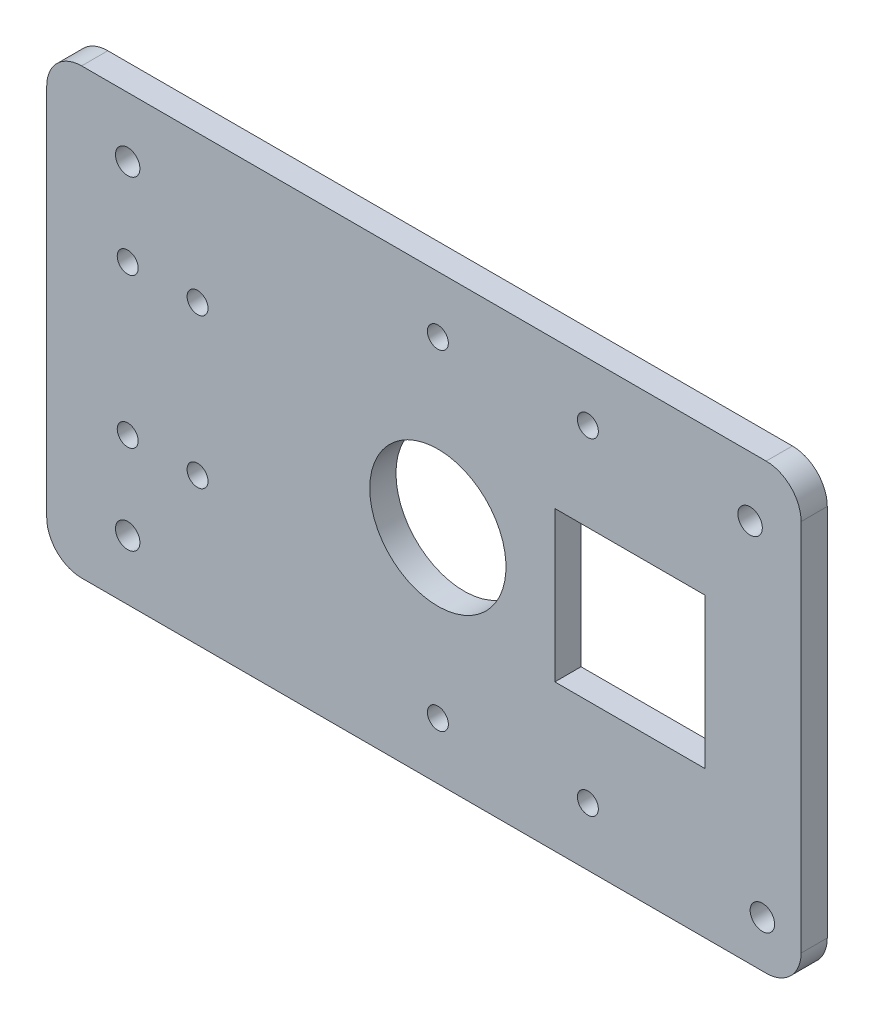
ISO-10303-21;
HEADER;
FILE_DESCRIPTION(('STEP AP214'),'2;1');
FILE_NAME('part.step','',(''),(''),'','','');
FILE_SCHEMA(('AUTOMOTIVE_DESIGN { 1 0 10303 214 1 1 1 1 }'));
ENDSEC;
DATA;
#1=APPLICATION_CONTEXT('core data for automotive mechanical design processes');
#2=APPLICATION_PROTOCOL_DEFINITION('international standard','automotive_design',2000,#1);
#3=PRODUCT_CONTEXT('',#1,'mechanical');
#4=PRODUCT('Part','Part','',(#3));
#5=PRODUCT_RELATED_PRODUCT_CATEGORY('part','',(#4));
#6=PRODUCT_DEFINITION_FORMATION('','',#4);
#7=PRODUCT_DEFINITION_CONTEXT('part definition',#1,'design');
#8=PRODUCT_DEFINITION('design','',#6,#7);
#9=PRODUCT_DEFINITION_SHAPE('','',#8);
#10=(LENGTH_UNIT() NAMED_UNIT(*) SI_UNIT(.MILLI.,.METRE.));
#11=(NAMED_UNIT(*) PLANE_ANGLE_UNIT() SI_UNIT($,.RADIAN.));
#12=(NAMED_UNIT(*) SI_UNIT($,.STERADIAN.) SOLID_ANGLE_UNIT());
#13=UNCERTAINTY_MEASURE_WITH_UNIT(LENGTH_MEASURE(1.E-05),#10,'distance_accuracy_value','');
#14=(GEOMETRIC_REPRESENTATION_CONTEXT(3) GLOBAL_UNCERTAINTY_ASSIGNED_CONTEXT((#13)) GLOBAL_UNIT_ASSIGNED_CONTEXT((#10,
#11,#12)) REPRESENTATION_CONTEXT('',''));
#15=CARTESIAN_POINT('',(0.,0.,0.));
#16=DIRECTION('',(0.,0.,1.));
#17=DIRECTION('',(1.,0.,0.));
#18=AXIS2_PLACEMENT_3D('',#15,#16,#17);
#19=CARTESIAN_POINT('',(0.,0.,17.5));
#20=DIRECTION('',(0.,0.,-1.));
#21=DIRECTION('',(-1.,0.,0.));
#22=AXIS2_PLACEMENT_3D('',#19,#20,#21);
#23=PLANE('',#22);
#24=CARTESIAN_POINT('',(-84.8116679666902,-46.37,17.5));
#25=DIRECTION('',(0.,0.,-1.));
#26=DIRECTION('',(-1.,0.,0.));
#27=AXIS2_PLACEMENT_3D('',#24,#25,#26);
#28=CIRCLE('',#27,3.50000000000001);
#29=CARTESIAN_POINT('',(-88.3116679666902,-46.37,17.5));
#30=VERTEX_POINT('',#29);
#31=EDGE_CURVE('E153',#30,#30,#28,.F.);
#32=ORIENTED_EDGE('',*,*,#31,.T.);
#33=EDGE_LOOP('',(#32));
#34=FACE_BOUND('',#33,.T.);
#35=CARTESIAN_POINT('',(93.3990574545653,46.37,17.5));
#36=DIRECTION('',(0.,0.,-1.));
#37=DIRECTION('',(-1.,0.,0.));
#38=AXIS2_PLACEMENT_3D('',#35,#36,#37);
#39=CIRCLE('',#38,3.50000000000001);
#40=CARTESIAN_POINT('',(89.8990574545653,46.37,17.5));
#41=VERTEX_POINT('',#40);
#42=EDGE_CURVE('E211',#41,#41,#39,.F.);
#43=ORIENTED_EDGE('',*,*,#42,.T.);
#44=EDGE_LOOP('',(#43));
#45=FACE_BOUND('',#44,.T.);
#46=CARTESIAN_POINT('',(46.9495287272827,46.81,17.5));
#47=DIRECTION('',(0.,0.,-1.));
#48=DIRECTION('',(-1.,0.,0.));
#49=AXIS2_PLACEMENT_3D('',#46,#47,#48);
#50=CIRCLE('',#49,2.99999999999999);
#51=CARTESIAN_POINT('',(43.9495287272827,46.81,17.5));
#52=VERTEX_POINT('',#51);
#53=EDGE_CURVE('E205',#52,#52,#50,.F.);
#54=ORIENTED_EDGE('',*,*,#53,.T.);
#55=EDGE_LOOP('',(#54));
#56=FACE_BOUND('',#55,.T.);
#57=CARTESIAN_POINT('',(-64.8116679666902,-21.4350000000001,17.5));
#58=DIRECTION('',(0.,0.,-1.));
#59=DIRECTION('',(-1.,0.,0.));
#60=AXIS2_PLACEMENT_3D('',#57,#58,#59);
#61=CIRCLE('',#60,2.99999999999999);
#62=CARTESIAN_POINT('',(-67.8116679666901,-21.4350000000001,17.5));
#63=VERTEX_POINT('',#62);
#64=EDGE_CURVE('E177',#63,#63,#61,.T.);
#65=ORIENTED_EDGE('',*,*,#64,.F.);
#66=EDGE_LOOP('',(#65));
#67=FACE_BOUND('',#66,.T.);
#68=CARTESIAN_POINT('',(-64.8116679666902,21.4349999999999,17.5));
#69=DIRECTION('',(0.,0.,-1.));
#70=DIRECTION('',(-1.,0.,0.));
#71=AXIS2_PLACEMENT_3D('',#68,#69,#70);
#72=CIRCLE('',#71,2.99999999999999);
#73=CARTESIAN_POINT('',(-67.8116679666901,21.4349999999999,17.5));
#74=VERTEX_POINT('',#73);
#75=EDGE_CURVE('E199',#74,#74,#72,.F.);
#76=ORIENTED_EDGE('',*,*,#75,.T.);
#77=EDGE_LOOP('',(#76));
#78=FACE_BOUND('',#77,.T.);
#79=CARTESIAN_POINT('',(4.00000000000006,-47.25,17.5));
#80=DIRECTION('',(0.,0.,-1.));
#81=DIRECTION('',(-1.,0.,0.));
#82=AXIS2_PLACEMENT_3D('',#79,#80,#81);
#83=CIRCLE('',#82,3.);
#84=CARTESIAN_POINT('',(1.00000000000006,-47.25,17.5));
#85=VERTEX_POINT('',#84);
#86=EDGE_CURVE('E179',#85,#85,#83,.T.);
#87=ORIENTED_EDGE('',*,*,#86,.F.);
#88=EDGE_LOOP('',(#87));
#89=FACE_BOUND('',#88,.T.);
#90=CARTESIAN_POINT('',(-84.8116679666902,-21.435,17.5));
#91=DIRECTION('',(0.,0.,-1.));
#92=DIRECTION('',(-1.,0.,0.));
#93=AXIS2_PLACEMENT_3D('',#90,#91,#92);
#94=CIRCLE('',#93,2.99999999999999);
#95=CARTESIAN_POINT('',(-87.8116679666901,-21.435,17.5));
#96=VERTEX_POINT('',#95);
#97=EDGE_CURVE('E37',#96,#96,#94,.T.);
#98=ORIENTED_EDGE('',*,*,#97,.F.);
#99=EDGE_LOOP('',(#98));
#100=FACE_BOUND('',#99,.T.);
#101=CARTESIAN_POINT('',(-84.8116679666902,21.435,17.5));
#102=DIRECTION('',(0.,0.,-1.));
#103=DIRECTION('',(-1.,0.,0.));
#104=AXIS2_PLACEMENT_3D('',#101,#102,#103);
#105=CIRCLE('',#104,2.99999999999999);
#106=CARTESIAN_POINT('',(-87.8116679666901,21.435,17.5));
#107=VERTEX_POINT('',#106);
#108=EDGE_CURVE('E202',#107,#107,#105,.F.);
#109=ORIENTED_EDGE('',*,*,#108,.T.);
#110=EDGE_LOOP('',(#109));
#111=FACE_BOUND('',#110,.T.);
#112=CARTESIAN_POINT('',(46.9495287272827,-46.81,17.5));
#113=DIRECTION('',(0.,0.,-1.));
#114=DIRECTION('',(-1.,0.,0.));
#115=AXIS2_PLACEMENT_3D('',#112,#113,#114);
#116=CIRCLE('',#115,2.99999999999999);
#117=CARTESIAN_POINT('',(43.9495287272827,-46.81,17.5));
#118=VERTEX_POINT('',#117);
#119=EDGE_CURVE('E174',#118,#118,#116,.T.);
#120=ORIENTED_EDGE('',*,*,#119,.F.);
#121=EDGE_LOOP('',(#120));
#122=FACE_BOUND('',#121,.T.);
#123=CARTESIAN_POINT('',(4.00000000000006,47.25,17.5));
#124=DIRECTION('',(0.,0.,-1.));
#125=DIRECTION('',(-1.,0.,0.));
#126=AXIS2_PLACEMENT_3D('',#123,#124,#125);
#127=CIRCLE('',#126,3.);
#128=CARTESIAN_POINT('',(1.00000000000006,47.25,17.5));
#129=VERTEX_POINT('',#128);
#130=EDGE_CURVE('E208',#129,#129,#127,.F.);
#131=ORIENTED_EDGE('',*,*,#130,.T.);
#132=EDGE_LOOP('',(#131));
#133=FACE_BOUND('',#132,.T.);
#134=CARTESIAN_POINT('',(96.9145553930181,-50.1725670547442,17.5));
#135=DIRECTION('',(0.,0.,-1.));
#136=DIRECTION('',(-1.,0.,0.));
#137=AXIS2_PLACEMENT_3D('',#134,#135,#136);
#138=CIRCLE('',#137,3.50000000000001);
#139=CARTESIAN_POINT('',(93.4145553930181,-50.1725670547442,17.5));
#140=VERTEX_POINT('',#139);
#141=EDGE_CURVE('E214',#140,#140,#138,.F.);
#142=ORIENTED_EDGE('',*,*,#141,.T.);
#143=EDGE_LOOP('',(#142));
#144=FACE_BOUND('',#143,.T.);
#145=CARTESIAN_POINT('',(-84.8116679666902,46.37,17.5));
#146=DIRECTION('',(0.,0.,-1.));
#147=DIRECTION('',(-1.,0.,0.));
#148=AXIS2_PLACEMENT_3D('',#145,#146,#147);
#149=CIRCLE('',#148,3.50000000000001);
#150=CARTESIAN_POINT('',(-88.3116679666902,46.37,17.5));
#151=VERTEX_POINT('',#150);
#152=EDGE_CURVE('E147',#151,#151,#149,.F.);
#153=ORIENTED_EDGE('',*,*,#152,.T.);
#154=EDGE_LOOP('',(#153));
#155=FACE_BOUND('',#154,.T.);
#156=DIRECTION('',(-1.,0.,0.));
#157=VECTOR('',#156,1.);
#158=CARTESIAN_POINT('',(37.5000000000001,21.5,17.5));
#159=LINE('',#158,#157);
#160=CARTESIAN_POINT('',(80.5000000000001,21.5,17.5));
#161=VERTEX_POINT('',#160);
#162=CARTESIAN_POINT('',(37.5000000000001,21.5,17.5));
#163=VERTEX_POINT('',#162);
#164=EDGE_CURVE('E127',#161,#163,#159,.T.);
#165=ORIENTED_EDGE('',*,*,#164,.T.);
#166=DIRECTION('',(0.,-1.,0.));
#167=VECTOR('',#166,1.);
#168=CARTESIAN_POINT('',(37.5000000000001,-21.5,17.5));
#169=LINE('',#168,#167);
#170=CARTESIAN_POINT('',(37.5000000000001,-21.5,17.5));
#171=VERTEX_POINT('',#170);
#172=EDGE_CURVE('E138',#163,#171,#169,.T.);
#173=ORIENTED_EDGE('',*,*,#172,.T.);
#174=DIRECTION('',(-1.,0.,0.));
#175=VECTOR('',#174,1.);
#176=CARTESIAN_POINT('',(37.5000000000001,-21.5,17.5));
#177=LINE('',#176,#175);
#178=CARTESIAN_POINT('',(80.5000000000001,-21.5,17.5));
#179=VERTEX_POINT('',#178);
#180=EDGE_CURVE('E140',#179,#171,#177,.T.);
#181=ORIENTED_EDGE('',*,*,#180,.F.);
#182=DIRECTION('',(0.,-1.,0.));
#183=VECTOR('',#182,1.);
#184=CARTESIAN_POINT('',(80.5000000000001,-21.5,17.5));
#185=LINE('',#184,#183);
#186=EDGE_CURVE('E139',#161,#179,#185,.T.);
#187=ORIENTED_EDGE('',*,*,#186,.F.);
#188=EDGE_LOOP('',(#165,#173,#181,#187));
#189=FACE_BOUND('',#188,.T.);
#190=CARTESIAN_POINT('',(-98.,53.5,17.5));
#191=DIRECTION('',(0.,0.,-1.));
#192=DIRECTION('',(-1.,0.,0.));
#193=AXIS2_PLACEMENT_3D('',#190,#191,#192);
#194=CIRCLE('',#193,10.);
#195=CARTESIAN_POINT('',(-98.,63.5,17.5));
#196=VERTEX_POINT('',#195);
#197=CARTESIAN_POINT('',(-108.,53.5,17.5));
#198=VERTEX_POINT('',#197);
#199=EDGE_CURVE('E165',#196,#198,#194,.F.);
#200=ORIENTED_EDGE('',*,*,#199,.F.);
#201=DIRECTION('',(1.,0.,0.));
#202=VECTOR('',#201,1.);
#203=CARTESIAN_POINT('',(-108.,63.5,17.5));
#204=LINE('',#203,#202);
#205=CARTESIAN_POINT('',(98.,63.5,17.5));
#206=VERTEX_POINT('',#205);
#207=EDGE_CURVE('E159',#196,#206,#204,.T.);
#208=ORIENTED_EDGE('',*,*,#207,.T.);
#209=CARTESIAN_POINT('',(98.,53.5,17.5));
#210=DIRECTION('',(0.,0.,-1.));
#211=DIRECTION('',(-1.,0.,0.));
#212=AXIS2_PLACEMENT_3D('',#209,#210,#211);
#213=CIRCLE('',#212,10.);
#214=CARTESIAN_POINT('',(108.,53.5,17.5));
#215=VERTEX_POINT('',#214);
#216=EDGE_CURVE('E169',#215,#206,#213,.F.);
#217=ORIENTED_EDGE('',*,*,#216,.F.);
#218=DIRECTION('',(0.,-1.,0.));
#219=VECTOR('',#218,1.);
#220=CARTESIAN_POINT('',(108.,63.5,17.5));
#221=LINE('',#220,#219);
#222=CARTESIAN_POINT('',(108.,-53.5,17.5));
#223=VERTEX_POINT('',#222);
#224=EDGE_CURVE('E141',#215,#223,#221,.T.);
#225=ORIENTED_EDGE('',*,*,#224,.T.);
#226=CARTESIAN_POINT('',(98.0000000000001,-53.5,17.5));
#227=DIRECTION('',(0.,0.,-1.));
#228=DIRECTION('',(-1.,0.,0.));
#229=AXIS2_PLACEMENT_3D('',#226,#227,#228);
#230=CIRCLE('',#229,10.);
#231=CARTESIAN_POINT('',(98.,-63.5,17.5));
#232=VERTEX_POINT('',#231);
#233=EDGE_CURVE('E171',#232,#223,#230,.F.);
#234=ORIENTED_EDGE('',*,*,#233,.F.);
#235=DIRECTION('',(-1.,0.,0.));
#236=VECTOR('',#235,1.);
#237=CARTESIAN_POINT('',(-108.,-63.5,17.5));
#238=LINE('',#237,#236);
#239=CARTESIAN_POINT('',(-98.,-63.5,17.5));
#240=VERTEX_POINT('',#239);
#241=EDGE_CURVE('E146',#232,#240,#238,.T.);
#242=ORIENTED_EDGE('',*,*,#241,.T.);
#243=CARTESIAN_POINT('',(-98.,-53.5,17.5));
#244=DIRECTION('',(0.,0.,-1.));
#245=DIRECTION('',(-1.,0.,0.));
#246=AXIS2_PLACEMENT_3D('',#243,#244,#245);
#247=CIRCLE('',#246,10.);
#248=CARTESIAN_POINT('',(-108.,-53.5,17.5));
#249=VERTEX_POINT('',#248);
#250=EDGE_CURVE('E167',#249,#240,#247,.F.);
#251=ORIENTED_EDGE('',*,*,#250,.F.);
#252=DIRECTION('',(0.,1.,0.));
#253=VECTOR('',#252,1.);
#254=CARTESIAN_POINT('',(-108.,63.5,17.5));
#255=LINE('',#254,#253);
#256=EDGE_CURVE('E150',#249,#198,#255,.T.);
#257=ORIENTED_EDGE('',*,*,#256,.T.);
#258=EDGE_LOOP('',(#200,#208,#217,#225,#234,#242,#251,#257));
#259=FACE_BOUND('',#258,.T.);
#260=CARTESIAN_POINT('',(4.00000000000006,0.,17.5));
#261=DIRECTION('',(0.,0.,-1.));
#262=DIRECTION('',(-1.,0.,0.));
#263=AXIS2_PLACEMENT_3D('',#260,#261,#262);
#264=CIRCLE('',#263,19.5);
#265=CARTESIAN_POINT('',(-15.4999999999999,0.,17.5));
#266=VERTEX_POINT('',#265);
#267=EDGE_CURVE('E308',#266,#266,#264,.T.);
#268=ORIENTED_EDGE('',*,*,#267,.F.);
#269=EDGE_LOOP('',(#268));
#270=FACE_BOUND('',#269,.T.);
#271=ADVANCED_FACE('F33',(#34,#45,#56,#67,#78,#89,#100,#111,#122,#133,#144,#155,#189,#259,#270),
#23,.T.);
#272=CARTESIAN_POINT('',(-108.,63.5,25.));
#273=DIRECTION('',(0.,-1.,0.));
#274=DIRECTION('',(0.,0.,-1.));
#275=AXIS2_PLACEMENT_3D('',#272,#273,#274);
#276=PLANE('',#275);
#277=ORIENTED_EDGE('',*,*,#207,.F.);
#278=DIRECTION('',(0.,0.,-1.));
#279=VECTOR('',#278,1.);
#280=CARTESIAN_POINT('',(-98.,63.5,25.));
#281=LINE('',#280,#279);
#282=CARTESIAN_POINT('',(-98.,63.5,25.));
#283=VERTEX_POINT('',#282);
#284=EDGE_CURVE('E294',#196,#283,#281,.F.);
#285=ORIENTED_EDGE('',*,*,#284,.T.);
#286=DIRECTION('',(-1.,0.,0.));
#287=VECTOR('',#286,1.);
#288=CARTESIAN_POINT('',(-108.,63.5,25.));
#289=LINE('',#288,#287);
#290=CARTESIAN_POINT('',(98.,63.5,25.));
#291=VERTEX_POINT('',#290);
#292=EDGE_CURVE('E303',#291,#283,#289,.T.);
#293=ORIENTED_EDGE('',*,*,#292,.F.);
#294=DIRECTION('',(0.,0.,-1.));
#295=VECTOR('',#294,1.);
#296=CARTESIAN_POINT('',(98.,63.5,25.));
#297=LINE('',#296,#295);
#298=EDGE_CURVE('E195',#291,#206,#297,.T.);
#299=ORIENTED_EDGE('',*,*,#298,.T.);
#300=EDGE_LOOP('',(#277,#285,#293,#299));
#301=FACE_BOUND('',#300,.T.);
#302=ADVANCED_FACE('F238',(#301),#276,.F.);
#303=CARTESIAN_POINT('',(0.,0.,25.));
#304=DIRECTION('',(0.,0.,1.));
#305=DIRECTION('',(1.,0.,0.));
#306=AXIS2_PLACEMENT_3D('',#303,#304,#305);
#307=PLANE('',#306);
#308=CARTESIAN_POINT('',(4.00000000000006,-47.25,25.));
#309=DIRECTION('',(0.,0.,1.));
#310=DIRECTION('',(1.,0.,0.));
#311=AXIS2_PLACEMENT_3D('',#308,#309,#310);
#312=CIRCLE('',#311,3.);
#313=CARTESIAN_POINT('',(7.00000000000006,-47.25,25.));
#314=VERTEX_POINT('',#313);
#315=EDGE_CURVE('E342',#314,#314,#312,.T.);
#316=ORIENTED_EDGE('',*,*,#315,.F.);
#317=EDGE_LOOP('',(#316));
#318=FACE_BOUND('',#317,.T.);
#319=CARTESIAN_POINT('',(-64.8116679666902,21.4349999999999,25.));
#320=DIRECTION('',(0.,0.,-1.));
#321=DIRECTION('',(-1.,0.,0.));
#322=AXIS2_PLACEMENT_3D('',#319,#320,#321);
#323=CIRCLE('',#322,2.99999999999999);
#324=CARTESIAN_POINT('',(-67.8116679666901,21.4349999999999,25.));
#325=VERTEX_POINT('',#324);
#326=EDGE_CURVE('E339',#325,#325,#323,.T.);
#327=ORIENTED_EDGE('',*,*,#326,.T.);
#328=EDGE_LOOP('',(#327));
#329=FACE_BOUND('',#328,.T.);
#330=CARTESIAN_POINT('',(-84.8116679666902,21.435,25.));
#331=DIRECTION('',(0.,0.,-1.));
#332=DIRECTION('',(-1.,0.,0.));
#333=AXIS2_PLACEMENT_3D('',#330,#331,#332);
#334=CIRCLE('',#333,2.99999999999999);
#335=CARTESIAN_POINT('',(-87.8116679666901,21.435,25.));
#336=VERTEX_POINT('',#335);
#337=EDGE_CURVE('E335',#336,#336,#334,.T.);
#338=ORIENTED_EDGE('',*,*,#337,.T.);
#339=EDGE_LOOP('',(#338));
#340=FACE_BOUND('',#339,.T.);
#341=CARTESIAN_POINT('',(46.9495287272827,-46.81,25.));
#342=DIRECTION('',(0.,0.,1.));
#343=DIRECTION('',(1.,0.,0.));
#344=AXIS2_PLACEMENT_3D('',#341,#342,#343);
#345=CIRCLE('',#344,2.99999999999999);
#346=CARTESIAN_POINT('',(49.9495287272827,-46.81,25.));
#347=VERTEX_POINT('',#346);
#348=EDGE_CURVE('E11',#347,#347,#345,.T.);
#349=ORIENTED_EDGE('',*,*,#348,.F.);
#350=EDGE_LOOP('',(#349));
#351=FACE_BOUND('',#350,.T.);
#352=CARTESIAN_POINT('',(4.00000000000006,47.25,25.));
#353=DIRECTION('',(0.,0.,-1.));
#354=DIRECTION('',(-1.,0.,0.));
#355=AXIS2_PLACEMENT_3D('',#352,#353,#354);
#356=CIRCLE('',#355,3.);
#357=CARTESIAN_POINT('',(1.00000000000006,47.25,25.));
#358=VERTEX_POINT('',#357);
#359=EDGE_CURVE('E327',#358,#358,#356,.T.);
#360=ORIENTED_EDGE('',*,*,#359,.T.);
#361=EDGE_LOOP('',(#360));
#362=FACE_BOUND('',#361,.T.);
#363=CARTESIAN_POINT('',(93.3990574545653,46.37,25.));
#364=DIRECTION('',(0.,0.,1.));
#365=DIRECTION('',(1.,0.,0.));
#366=AXIS2_PLACEMENT_3D('',#363,#364,#365);
#367=CIRCLE('',#366,3.50000000000001);
#368=CARTESIAN_POINT('',(96.8990574545653,46.37,25.));
#369=VERTEX_POINT('',#368);
#370=EDGE_CURVE('E324',#369,#369,#367,.T.);
#371=ORIENTED_EDGE('',*,*,#370,.F.);
#372=EDGE_LOOP('',(#371));
#373=FACE_BOUND('',#372,.T.);
#374=CARTESIAN_POINT('',(96.9145553930181,-50.1725670547442,25.));
#375=DIRECTION('',(0.,0.,1.));
#376=DIRECTION('',(1.,0.,0.));
#377=AXIS2_PLACEMENT_3D('',#374,#375,#376);
#378=CIRCLE('',#377,3.50000000000001);
#379=CARTESIAN_POINT('',(100.414555393018,-50.1725670547442,25.));
#380=VERTEX_POINT('',#379);
#381=EDGE_CURVE('E328',#380,#380,#378,.T.);
#382=ORIENTED_EDGE('',*,*,#381,.F.);
#383=EDGE_LOOP('',(#382));
#384=FACE_BOUND('',#383,.T.);
#385=CARTESIAN_POINT('',(-84.8116679666902,-46.37,25.));
#386=DIRECTION('',(0.,0.,1.));
#387=DIRECTION('',(1.,0.,0.));
#388=AXIS2_PLACEMENT_3D('',#385,#386,#387);
#389=CIRCLE('',#388,3.50000000000001);
#390=CARTESIAN_POINT('',(-81.3116679666902,-46.37,25.));
#391=VERTEX_POINT('',#390);
#392=EDGE_CURVE('E323',#391,#391,#389,.T.);
#393=ORIENTED_EDGE('',*,*,#392,.F.);
#394=EDGE_LOOP('',(#393));
#395=FACE_BOUND('',#394,.T.);
#396=CARTESIAN_POINT('',(-84.8116679666902,46.37,25.));
#397=DIRECTION('',(0.,0.,1.));
#398=DIRECTION('',(1.,0.,0.));
#399=AXIS2_PLACEMENT_3D('',#396,#397,#398);
#400=CIRCLE('',#399,3.50000000000001);
#401=CARTESIAN_POINT('',(-81.3116679666902,46.37,25.));
#402=VERTEX_POINT('',#401);
#403=EDGE_CURVE('E320',#402,#402,#400,.T.);
#404=ORIENTED_EDGE('',*,*,#403,.F.);
#405=EDGE_LOOP('',(#404));
#406=FACE_BOUND('',#405,.T.);
#407=DIRECTION('',(0.,1.,0.));
#408=VECTOR('',#407,1.);
#409=CARTESIAN_POINT('',(37.5000000000001,-21.5,25.));
#410=LINE('',#409,#408);
#411=CARTESIAN_POINT('',(37.5000000000001,-21.5,25.));
#412=VERTEX_POINT('',#411);
#413=CARTESIAN_POINT('',(37.5000000000001,21.5,25.));
#414=VERTEX_POINT('',#413);
#415=EDGE_CURVE('E318',#412,#414,#410,.T.);
#416=ORIENTED_EDGE('',*,*,#415,.T.);
#417=DIRECTION('',(1.,0.,0.));
#418=VECTOR('',#417,1.);
#419=CARTESIAN_POINT('',(37.5000000000001,21.5,25.));
#420=LINE('',#419,#418);
#421=CARTESIAN_POINT('',(80.5000000000001,21.5,25.));
#422=VERTEX_POINT('',#421);
#423=EDGE_CURVE('E130',#414,#422,#420,.T.);
#424=ORIENTED_EDGE('',*,*,#423,.T.);
#425=DIRECTION('',(0.,1.,0.));
#426=VECTOR('',#425,1.);
#427=CARTESIAN_POINT('',(80.5000000000001,-21.5,25.));
#428=LINE('',#427,#426);
#429=CARTESIAN_POINT('',(80.5000000000001,-21.5,25.));
#430=VERTEX_POINT('',#429);
#431=EDGE_CURVE('E314',#430,#422,#428,.T.);
#432=ORIENTED_EDGE('',*,*,#431,.F.);
#433=DIRECTION('',(1.,0.,0.));
#434=VECTOR('',#433,1.);
#435=CARTESIAN_POINT('',(37.5000000000001,-21.5,25.));
#436=LINE('',#435,#434);
#437=EDGE_CURVE('E58',#412,#430,#436,.T.);
#438=ORIENTED_EDGE('',*,*,#437,.F.);
#439=EDGE_LOOP('',(#416,#424,#432,#438));
#440=FACE_BOUND('',#439,.T.);
#441=CARTESIAN_POINT('',(4.00000000000006,0.,25.));
#442=DIRECTION('',(0.,0.,-1.));
#443=DIRECTION('',(-1.,0.,0.));
#444=AXIS2_PLACEMENT_3D('',#441,#442,#443);
#445=CIRCLE('',#444,19.5);
#446=CARTESIAN_POINT('',(-15.4999999999999,0.,25.));
#447=VERTEX_POINT('',#446);
#448=EDGE_CURVE('E307',#447,#447,#445,.T.);
#449=ORIENTED_EDGE('',*,*,#448,.T.);
#450=EDGE_LOOP('',(#449));
#451=FACE_BOUND('',#450,.T.);
#452=DIRECTION('',(0.,-1.,0.));
#453=VECTOR('',#452,1.);
#454=CARTESIAN_POINT('',(-108.,63.5,25.));
#455=LINE('',#454,#453);
#456=CARTESIAN_POINT('',(-108.,53.5,25.));
#457=VERTEX_POINT('',#456);
#458=CARTESIAN_POINT('',(-108.,-53.5,25.));
#459=VERTEX_POINT('',#458);
#460=EDGE_CURVE('E299',#457,#459,#455,.T.);
#461=ORIENTED_EDGE('',*,*,#460,.T.);
#462=CARTESIAN_POINT('',(-98.,-53.5,25.));
#463=DIRECTION('',(0.,0.,1.));
#464=DIRECTION('',(1.,0.,0.));
#465=AXIS2_PLACEMENT_3D('',#462,#463,#464);
#466=CIRCLE('',#465,10.);
#467=CARTESIAN_POINT('',(-98.,-63.5,25.));
#468=VERTEX_POINT('',#467);
#469=EDGE_CURVE('E286',#459,#468,#466,.T.);
#470=ORIENTED_EDGE('',*,*,#469,.T.);
#471=DIRECTION('',(1.,0.,0.));
#472=VECTOR('',#471,1.);
#473=CARTESIAN_POINT('',(-108.,-63.5,25.));
#474=LINE('',#473,#472);
#475=CARTESIAN_POINT('',(98.,-63.5,25.));
#476=VERTEX_POINT('',#475);
#477=EDGE_CURVE('E296',#468,#476,#474,.T.);
#478=ORIENTED_EDGE('',*,*,#477,.T.);
#479=CARTESIAN_POINT('',(98.0000000000001,-53.5,25.));
#480=DIRECTION('',(0.,0.,1.));
#481=DIRECTION('',(1.,0.,0.));
#482=AXIS2_PLACEMENT_3D('',#479,#480,#481);
#483=CIRCLE('',#482,10.);
#484=CARTESIAN_POINT('',(108.,-53.5,25.));
#485=VERTEX_POINT('',#484);
#486=EDGE_CURVE('E285',#476,#485,#483,.T.);
#487=ORIENTED_EDGE('',*,*,#486,.T.);
#488=DIRECTION('',(0.,1.,0.));
#489=VECTOR('',#488,1.);
#490=CARTESIAN_POINT('',(108.,63.5,25.));
#491=LINE('',#490,#489);
#492=CARTESIAN_POINT('',(108.,53.5,25.));
#493=VERTEX_POINT('',#492);
#494=EDGE_CURVE('E305',#485,#493,#491,.T.);
#495=ORIENTED_EDGE('',*,*,#494,.T.);
#496=CARTESIAN_POINT('',(98.,53.5,25.));
#497=DIRECTION('',(0.,0.,1.));
#498=DIRECTION('',(1.,0.,0.));
#499=AXIS2_PLACEMENT_3D('',#496,#497,#498);
#500=CIRCLE('',#499,10.);
#501=EDGE_CURVE('E280',#493,#291,#500,.T.);
#502=ORIENTED_EDGE('',*,*,#501,.T.);
#503=ORIENTED_EDGE('',*,*,#292,.T.);
#504=CARTESIAN_POINT('',(-98.,53.5,25.));
#505=DIRECTION('',(0.,0.,1.));
#506=DIRECTION('',(1.,0.,0.));
#507=AXIS2_PLACEMENT_3D('',#504,#505,#506);
#508=CIRCLE('',#507,10.);
#509=EDGE_CURVE('E292',#283,#457,#508,.T.);
#510=ORIENTED_EDGE('',*,*,#509,.T.);
#511=EDGE_LOOP('',(#461,#470,#478,#487,#495,#502,#503,#510));
#512=FACE_BOUND('',#511,.T.);
#513=CARTESIAN_POINT('',(46.9495287272827,46.81,25.));
#514=DIRECTION('',(0.,0.,-1.));
#515=DIRECTION('',(-1.,0.,0.));
#516=AXIS2_PLACEMENT_3D('',#513,#514,#515);
#517=CIRCLE('',#516,2.99999999999999);
#518=CARTESIAN_POINT('',(43.9495287272827,46.81,25.));
#519=VERTEX_POINT('',#518);
#520=EDGE_CURVE('E42',#519,#519,#517,.T.);
#521=ORIENTED_EDGE('',*,*,#520,.T.);
#522=EDGE_LOOP('',(#521));
#523=FACE_BOUND('',#522,.T.);
#524=CARTESIAN_POINT('',(-64.8116679666902,-21.4350000000001,25.));
#525=DIRECTION('',(0.,0.,1.));
#526=DIRECTION('',(1.,0.,0.));
#527=AXIS2_PLACEMENT_3D('',#524,#525,#526);
#528=CIRCLE('',#527,2.99999999999999);
#529=CARTESIAN_POINT('',(-61.8116679666902,-21.4350000000001,25.));
#530=VERTEX_POINT('',#529);
#531=EDGE_CURVE('E338',#530,#530,#528,.T.);
#532=ORIENTED_EDGE('',*,*,#531,.F.);
#533=EDGE_LOOP('',(#532));
#534=FACE_BOUND('',#533,.T.);
#535=CARTESIAN_POINT('',(-84.8116679666902,-21.435,25.));
#536=DIRECTION('',(0.,0.,1.));
#537=DIRECTION('',(1.,0.,0.));
#538=AXIS2_PLACEMENT_3D('',#535,#536,#537);
#539=CIRCLE('',#538,2.99999999999999);
#540=CARTESIAN_POINT('',(-81.8116679666902,-21.435,25.));
#541=VERTEX_POINT('',#540);
#542=EDGE_CURVE('E334',#541,#541,#539,.T.);
#543=ORIENTED_EDGE('',*,*,#542,.F.);
#544=EDGE_LOOP('',(#543));
#545=FACE_BOUND('',#544,.T.);
#546=ADVANCED_FACE('F240',(#318,#329,#340,#351,#362,#373,#384,#395,#406,#440,#451,#512,#523,
#534,#545),#307,.T.);
#547=CARTESIAN_POINT('',(-84.8116679666902,-21.435,25.));
#548=DIRECTION('',(0.,0.,-1.));
#549=DIRECTION('',(-1.,0.,0.));
#550=AXIS2_PLACEMENT_3D('',#547,#548,#549);
#551=CYLINDRICAL_SURFACE('',#550,2.99999999999999);
#552=ORIENTED_EDGE('',*,*,#542,.T.);
#553=EDGE_LOOP('',(#552));
#554=FACE_BOUND('',#553,.T.);
#555=ORIENTED_EDGE('',*,*,#97,.T.);
#556=EDGE_LOOP('',(#555));
#557=FACE_BOUND('',#556,.T.);
#558=ADVANCED_FACE('F247',(#554,#557),#551,.F.);
#559=CARTESIAN_POINT('',(4.00000000000006,-47.25,25.));
#560=DIRECTION('',(0.,0.,-1.));
#561=DIRECTION('',(-1.,0.,0.));
#562=AXIS2_PLACEMENT_3D('',#559,#560,#561);
#563=CYLINDRICAL_SURFACE('',#562,3.);
#564=ORIENTED_EDGE('',*,*,#315,.T.);
#565=EDGE_LOOP('',(#564));
#566=FACE_BOUND('',#565,.T.);
#567=ORIENTED_EDGE('',*,*,#86,.T.);
#568=EDGE_LOOP('',(#567));
#569=FACE_BOUND('',#568,.T.);
#570=ADVANCED_FACE('F392',(#566,#569),#563,.F.);
#571=CARTESIAN_POINT('',(-64.8116679666902,21.4349999999999,25.));
#572=DIRECTION('',(0.,0.,-1.));
#573=DIRECTION('',(-1.,0.,0.));
#574=AXIS2_PLACEMENT_3D('',#571,#572,#573);
#575=CYLINDRICAL_SURFACE('',#574,2.99999999999999);
#576=ORIENTED_EDGE('',*,*,#326,.F.);
#577=EDGE_LOOP('',(#576));
#578=FACE_BOUND('',#577,.T.);
#579=ORIENTED_EDGE('',*,*,#75,.F.);
#580=EDGE_LOOP('',(#579));
#581=FACE_BOUND('',#580,.T.);
#582=ADVANCED_FACE('F396',(#578,#581),#575,.F.);
#583=CARTESIAN_POINT('',(-84.8116679666902,21.435,25.));
#584=DIRECTION('',(0.,0.,-1.));
#585=DIRECTION('',(-1.,0.,0.));
#586=AXIS2_PLACEMENT_3D('',#583,#584,#585);
#587=CYLINDRICAL_SURFACE('',#586,2.99999999999999);
#588=ORIENTED_EDGE('',*,*,#337,.F.);
#589=EDGE_LOOP('',(#588));
#590=FACE_BOUND('',#589,.T.);
#591=ORIENTED_EDGE('',*,*,#108,.F.);
#592=EDGE_LOOP('',(#591));
#593=FACE_BOUND('',#592,.T.);
#594=ADVANCED_FACE('F400',(#590,#593),#587,.F.);
#595=CARTESIAN_POINT('',(-64.8116679666902,-21.4350000000001,25.));
#596=DIRECTION('',(0.,0.,-1.));
#597=DIRECTION('',(-1.,0.,0.));
#598=AXIS2_PLACEMENT_3D('',#595,#596,#597);
#599=CYLINDRICAL_SURFACE('',#598,2.99999999999999);
#600=ORIENTED_EDGE('',*,*,#531,.T.);
#601=EDGE_LOOP('',(#600));
#602=FACE_BOUND('',#601,.T.);
#603=ORIENTED_EDGE('',*,*,#64,.T.);
#604=EDGE_LOOP('',(#603));
#605=FACE_BOUND('',#604,.T.);
#606=ADVANCED_FACE('F404',(#602,#605),#599,.F.);
#607=CARTESIAN_POINT('',(46.9495287272827,46.81,25.));
#608=DIRECTION('',(0.,0.,-1.));
#609=DIRECTION('',(-1.,0.,0.));
#610=AXIS2_PLACEMENT_3D('',#607,#608,#609);
#611=CYLINDRICAL_SURFACE('',#610,2.99999999999999);
#612=ORIENTED_EDGE('',*,*,#520,.F.);
#613=EDGE_LOOP('',(#612));
#614=FACE_BOUND('',#613,.T.);
#615=ORIENTED_EDGE('',*,*,#53,.F.);
#616=EDGE_LOOP('',(#615));
#617=FACE_BOUND('',#616,.T.);
#618=ADVANCED_FACE('F408',(#614,#617),#611,.F.);
#619=CARTESIAN_POINT('',(46.9495287272827,-46.81,25.));
#620=DIRECTION('',(0.,0.,-1.));
#621=DIRECTION('',(-1.,0.,0.));
#622=AXIS2_PLACEMENT_3D('',#619,#620,#621);
#623=CYLINDRICAL_SURFACE('',#622,2.99999999999999);
#624=ORIENTED_EDGE('',*,*,#348,.T.);
#625=EDGE_LOOP('',(#624));
#626=FACE_BOUND('',#625,.T.);
#627=ORIENTED_EDGE('',*,*,#119,.T.);
#628=EDGE_LOOP('',(#627));
#629=FACE_BOUND('',#628,.T.);
#630=ADVANCED_FACE('F412',(#626,#629),#623,.F.);
#631=CARTESIAN_POINT('',(4.00000000000006,47.25,25.));
#632=DIRECTION('',(0.,0.,-1.));
#633=DIRECTION('',(-1.,0.,0.));
#634=AXIS2_PLACEMENT_3D('',#631,#632,#633);
#635=CYLINDRICAL_SURFACE('',#634,3.);
#636=ORIENTED_EDGE('',*,*,#359,.F.);
#637=EDGE_LOOP('',(#636));
#638=FACE_BOUND('',#637,.T.);
#639=ORIENTED_EDGE('',*,*,#130,.F.);
#640=EDGE_LOOP('',(#639));
#641=FACE_BOUND('',#640,.T.);
#642=ADVANCED_FACE('F416',(#638,#641),#635,.F.);
#643=CARTESIAN_POINT('',(93.3990574545653,46.37,-53.75));
#644=DIRECTION('',(0.,0.,1.));
#645=DIRECTION('',(1.,0.,0.));
#646=AXIS2_PLACEMENT_3D('',#643,#644,#645);
#647=CYLINDRICAL_SURFACE('',#646,3.50000000000001);
#648=ORIENTED_EDGE('',*,*,#370,.T.);
#649=EDGE_LOOP('',(#648));
#650=FACE_BOUND('',#649,.T.);
#651=ORIENTED_EDGE('',*,*,#42,.F.);
#652=EDGE_LOOP('',(#651));
#653=FACE_BOUND('',#652,.T.);
#654=ADVANCED_FACE('F234',(#650,#653),#647,.F.);
#655=CARTESIAN_POINT('',(96.9145553930181,-50.1725670547442,-53.75));
#656=DIRECTION('',(0.,0.,1.));
#657=DIRECTION('',(1.,0.,0.));
#658=AXIS2_PLACEMENT_3D('',#655,#656,#657);
#659=CYLINDRICAL_SURFACE('',#658,3.50000000000001);
#660=ORIENTED_EDGE('',*,*,#381,.T.);
#661=EDGE_LOOP('',(#660));
#662=FACE_BOUND('',#661,.T.);
#663=ORIENTED_EDGE('',*,*,#141,.F.);
#664=EDGE_LOOP('',(#663));
#665=FACE_BOUND('',#664,.T.);
#666=ADVANCED_FACE('F224',(#662,#665),#659,.F.);
#667=CARTESIAN_POINT('',(-84.8116679666902,-46.37,-53.75));
#668=DIRECTION('',(0.,0.,1.));
#669=DIRECTION('',(1.,0.,0.));
#670=AXIS2_PLACEMENT_3D('',#667,#668,#669);
#671=CYLINDRICAL_SURFACE('',#670,3.50000000000001);
#672=ORIENTED_EDGE('',*,*,#392,.T.);
#673=EDGE_LOOP('',(#672));
#674=FACE_BOUND('',#673,.T.);
#675=ORIENTED_EDGE('',*,*,#31,.F.);
#676=EDGE_LOOP('',(#675));
#677=FACE_BOUND('',#676,.T.);
#678=ADVANCED_FACE('F221',(#674,#677),#671,.F.);
#679=CARTESIAN_POINT('',(-84.8116679666902,46.37,-53.75));
#680=DIRECTION('',(0.,0.,1.));
#681=DIRECTION('',(1.,0.,0.));
#682=AXIS2_PLACEMENT_3D('',#679,#680,#681);
#683=CYLINDRICAL_SURFACE('',#682,3.50000000000001);
#684=ORIENTED_EDGE('',*,*,#403,.T.);
#685=EDGE_LOOP('',(#684));
#686=FACE_BOUND('',#685,.T.);
#687=ORIENTED_EDGE('',*,*,#152,.F.);
#688=EDGE_LOOP('',(#687));
#689=FACE_BOUND('',#688,.T.);
#690=ADVANCED_FACE('F223',(#686,#689),#683,.F.);
#691=CARTESIAN_POINT('',(37.5000000000001,-21.5,25.));
#692=DIRECTION('',(0.,1.,0.));
#693=DIRECTION('',(-1.,0.,0.));
#694=AXIS2_PLACEMENT_3D('',#691,#692,#693);
#695=PLANE('',#694);
#696=DIRECTION('',(0.,0.,-1.));
#697=VECTOR('',#696,1.);
#698=CARTESIAN_POINT('',(80.5000000000001,-21.5,25.));
#699=LINE('',#698,#697);
#700=EDGE_CURVE('E352',#430,#179,#699,.T.);
#701=ORIENTED_EDGE('',*,*,#700,.T.);
#702=ORIENTED_EDGE('',*,*,#180,.T.);
#703=DIRECTION('',(0.,0.,-1.));
#704=VECTOR('',#703,1.);
#705=CARTESIAN_POINT('',(37.5000000000001,-21.5,25.));
#706=LINE('',#705,#704);
#707=EDGE_CURVE('E144',#412,#171,#706,.T.);
#708=ORIENTED_EDGE('',*,*,#707,.F.);
#709=ORIENTED_EDGE('',*,*,#437,.T.);
#710=EDGE_LOOP('',(#701,#702,#708,#709));
#711=FACE_BOUND('',#710,.T.);
#712=ADVANCED_FACE('F231',(#711),#695,.T.);
#713=CARTESIAN_POINT('',(37.5000000000001,21.5,25.));
#714=DIRECTION('',(0.,1.,0.));
#715=DIRECTION('',(-1.,0.,0.));
#716=AXIS2_PLACEMENT_3D('',#713,#714,#715);
#717=PLANE('',#716);
#718=ORIENTED_EDGE('',*,*,#164,.F.);
#719=DIRECTION('',(0.,0.,-1.));
#720=VECTOR('',#719,1.);
#721=CARTESIAN_POINT('',(80.5000000000001,21.5,25.));
#722=LINE('',#721,#720);
#723=EDGE_CURVE('E132',#422,#161,#722,.T.);
#724=ORIENTED_EDGE('',*,*,#723,.F.);
#725=ORIENTED_EDGE('',*,*,#423,.F.);
#726=DIRECTION('',(0.,0.,-1.));
#727=VECTOR('',#726,1.);
#728=CARTESIAN_POINT('',(37.5000000000001,21.5,25.));
#729=LINE('',#728,#727);
#730=EDGE_CURVE('E50',#414,#163,#729,.T.);
#731=ORIENTED_EDGE('',*,*,#730,.T.);
#732=EDGE_LOOP('',(#718,#724,#725,#731));
#733=FACE_BOUND('',#732,.T.);
#734=ADVANCED_FACE('F126',(#733),#717,.F.);
#735=CARTESIAN_POINT('',(80.5000000000001,-21.5,25.));
#736=DIRECTION('',(-1.,0.,0.));
#737=DIRECTION('',(0.,0.,1.));
#738=AXIS2_PLACEMENT_3D('',#735,#736,#737);
#739=PLANE('',#738);
#740=ORIENTED_EDGE('',*,*,#723,.T.);
#741=ORIENTED_EDGE('',*,*,#186,.T.);
#742=ORIENTED_EDGE('',*,*,#700,.F.);
#743=ORIENTED_EDGE('',*,*,#431,.T.);
#744=EDGE_LOOP('',(#740,#741,#742,#743));
#745=FACE_BOUND('',#744,.T.);
#746=ADVANCED_FACE('F387',(#745),#739,.T.);
#747=CARTESIAN_POINT('',(37.5000000000001,-21.5,25.));
#748=DIRECTION('',(-1.,0.,0.));
#749=DIRECTION('',(0.,-1.,0.));
#750=AXIS2_PLACEMENT_3D('',#747,#748,#749);
#751=PLANE('',#750);
#752=ORIENTED_EDGE('',*,*,#172,.F.);
#753=ORIENTED_EDGE('',*,*,#730,.F.);
#754=ORIENTED_EDGE('',*,*,#415,.F.);
#755=ORIENTED_EDGE('',*,*,#707,.T.);
#756=EDGE_LOOP('',(#752,#753,#754,#755));
#757=FACE_BOUND('',#756,.T.);
#758=ADVANCED_FACE('F143',(#757),#751,.F.);
#759=CARTESIAN_POINT('',(4.00000000000006,0.,25.));
#760=DIRECTION('',(0.,0.,-1.));
#761=DIRECTION('',(-1.,0.,0.));
#762=AXIS2_PLACEMENT_3D('',#759,#760,#761);
#763=CYLINDRICAL_SURFACE('',#762,19.5);
#764=ORIENTED_EDGE('',*,*,#448,.F.);
#765=EDGE_LOOP('',(#764));
#766=FACE_BOUND('',#765,.T.);
#767=ORIENTED_EDGE('',*,*,#267,.T.);
#768=EDGE_LOOP('',(#767));
#769=FACE_BOUND('',#768,.T.);
#770=ADVANCED_FACE('F379',(#766,#769),#763,.F.);
#771=CARTESIAN_POINT('',(108.,63.5,25.));
#772=DIRECTION('',(-1.,0.,0.));
#773=DIRECTION('',(0.,-1.,0.));
#774=AXIS2_PLACEMENT_3D('',#771,#772,#773);
#775=PLANE('',#774);
#776=ORIENTED_EDGE('',*,*,#224,.F.);
#777=DIRECTION('',(0.,0.,-1.));
#778=VECTOR('',#777,1.);
#779=CARTESIAN_POINT('',(108.,53.5,25.));
#780=LINE('',#779,#778);
#781=EDGE_CURVE('E184',#215,#493,#780,.F.);
#782=ORIENTED_EDGE('',*,*,#781,.T.);
#783=ORIENTED_EDGE('',*,*,#494,.F.);
#784=DIRECTION('',(0.,0.,-1.));
#785=VECTOR('',#784,1.);
#786=CARTESIAN_POINT('',(108.,-53.5,25.));
#787=LINE('',#786,#785);
#788=EDGE_CURVE('E187',#485,#223,#787,.T.);
#789=ORIENTED_EDGE('',*,*,#788,.T.);
#790=EDGE_LOOP('',(#776,#782,#783,#789));
#791=FACE_BOUND('',#790,.T.);
#792=ADVANCED_FACE('F255',(#791),#775,.F.);
#793=CARTESIAN_POINT('',(-108.,-63.5,25.));
#794=DIRECTION('',(0.,1.,0.));
#795=DIRECTION('',(0.,0.,1.));
#796=AXIS2_PLACEMENT_3D('',#793,#794,#795);
#797=PLANE('',#796);
#798=ORIENTED_EDGE('',*,*,#241,.F.);
#799=DIRECTION('',(0.,0.,-1.));
#800=VECTOR('',#799,1.);
#801=CARTESIAN_POINT('',(98.,-63.5,25.));
#802=LINE('',#801,#800);
#803=EDGE_CURVE('E295',#232,#476,#802,.F.);
#804=ORIENTED_EDGE('',*,*,#803,.T.);
#805=ORIENTED_EDGE('',*,*,#477,.F.);
#806=DIRECTION('',(0.,0.,-1.));
#807=VECTOR('',#806,1.);
#808=CARTESIAN_POINT('',(-98.,-63.5,25.));
#809=LINE('',#808,#807);
#810=EDGE_CURVE('E359',#468,#240,#809,.T.);
#811=ORIENTED_EDGE('',*,*,#810,.T.);
#812=EDGE_LOOP('',(#798,#804,#805,#811));
#813=FACE_BOUND('',#812,.T.);
#814=ADVANCED_FACE('F263',(#813),#797,.F.);
#815=CARTESIAN_POINT('',(98.0000000000001,-53.5,25.));
#816=DIRECTION('',(0.,0.,-1.));
#817=DIRECTION('',(-1.,0.,0.));
#818=AXIS2_PLACEMENT_3D('',#815,#816,#817);
#819=CYLINDRICAL_SURFACE('',#818,10.);
#820=ORIENTED_EDGE('',*,*,#803,.F.);
#821=ORIENTED_EDGE('',*,*,#233,.T.);
#822=ORIENTED_EDGE('',*,*,#788,.F.);
#823=ORIENTED_EDGE('',*,*,#486,.F.);
#824=EDGE_LOOP('',(#820,#821,#822,#823));
#825=FACE_BOUND('',#824,.T.);
#826=ADVANCED_FACE('F35',(#825),#819,.T.);
#827=CARTESIAN_POINT('',(98.,53.5,25.));
#828=DIRECTION('',(0.,0.,-1.));
#829=DIRECTION('',(-1.,0.,0.));
#830=AXIS2_PLACEMENT_3D('',#827,#828,#829);
#831=CYLINDRICAL_SURFACE('',#830,10.);
#832=ORIENTED_EDGE('',*,*,#781,.F.);
#833=ORIENTED_EDGE('',*,*,#216,.T.);
#834=ORIENTED_EDGE('',*,*,#298,.F.);
#835=ORIENTED_EDGE('',*,*,#501,.F.);
#836=EDGE_LOOP('',(#832,#833,#834,#835));
#837=FACE_BOUND('',#836,.T.);
#838=ADVANCED_FACE('F261',(#837),#831,.T.);
#839=CARTESIAN_POINT('',(-108.,63.5,25.));
#840=DIRECTION('',(1.,0.,0.));
#841=DIRECTION('',(0.,1.,0.));
#842=AXIS2_PLACEMENT_3D('',#839,#840,#841);
#843=PLANE('',#842);
#844=ORIENTED_EDGE('',*,*,#256,.F.);
#845=DIRECTION('',(0.,0.,-1.));
#846=VECTOR('',#845,1.);
#847=CARTESIAN_POINT('',(-108.,-53.5,25.));
#848=LINE('',#847,#846);
#849=EDGE_CURVE('E288',#249,#459,#848,.F.);
#850=ORIENTED_EDGE('',*,*,#849,.T.);
#851=ORIENTED_EDGE('',*,*,#460,.F.);
#852=DIRECTION('',(0.,0.,-1.));
#853=VECTOR('',#852,1.);
#854=CARTESIAN_POINT('',(-108.,53.5,25.));
#855=LINE('',#854,#853);
#856=EDGE_CURVE('E300',#457,#198,#855,.T.);
#857=ORIENTED_EDGE('',*,*,#856,.T.);
#858=EDGE_LOOP('',(#844,#850,#851,#857));
#859=FACE_BOUND('',#858,.T.);
#860=ADVANCED_FACE('F257',(#859),#843,.F.);
#861=CARTESIAN_POINT('',(-98.,-53.5,25.));
#862=DIRECTION('',(0.,0.,-1.));
#863=DIRECTION('',(-1.,0.,0.));
#864=AXIS2_PLACEMENT_3D('',#861,#862,#863);
#865=CYLINDRICAL_SURFACE('',#864,10.);
#866=ORIENTED_EDGE('',*,*,#849,.F.);
#867=ORIENTED_EDGE('',*,*,#250,.T.);
#868=ORIENTED_EDGE('',*,*,#810,.F.);
#869=ORIENTED_EDGE('',*,*,#469,.F.);
#870=EDGE_LOOP('',(#866,#867,#868,#869));
#871=FACE_BOUND('',#870,.T.);
#872=ADVANCED_FACE('F260',(#871),#865,.T.);
#873=CARTESIAN_POINT('',(-98.,53.5,25.));
#874=DIRECTION('',(0.,0.,-1.));
#875=DIRECTION('',(-1.,0.,0.));
#876=AXIS2_PLACEMENT_3D('',#873,#874,#875);
#877=CYLINDRICAL_SURFACE('',#876,10.);
#878=ORIENTED_EDGE('',*,*,#284,.F.);
#879=ORIENTED_EDGE('',*,*,#199,.T.);
#880=ORIENTED_EDGE('',*,*,#856,.F.);
#881=ORIENTED_EDGE('',*,*,#509,.F.);
#882=EDGE_LOOP('',(#878,#879,#880,#881));
#883=FACE_BOUND('',#882,.T.);
#884=ADVANCED_FACE('F251',(#883),#877,.T.);
#885=CLOSED_SHELL('',(#271,#302,#546,#558,#570,#582,#594,#606,#618,#630,#642,#654,#666,#678,
#690,#712,#734,#746,#758,#770,#792,#814,#826,#838,#860,#872,#884));
#886=MANIFOLD_SOLID_BREP('B2',#885);
#887=ADVANCED_BREP_SHAPE_REPRESENTATION('',(#18,#886),#14);
#888=SHAPE_DEFINITION_REPRESENTATION(#9,#887);
ENDSEC;
END-ISO-10303-21;
